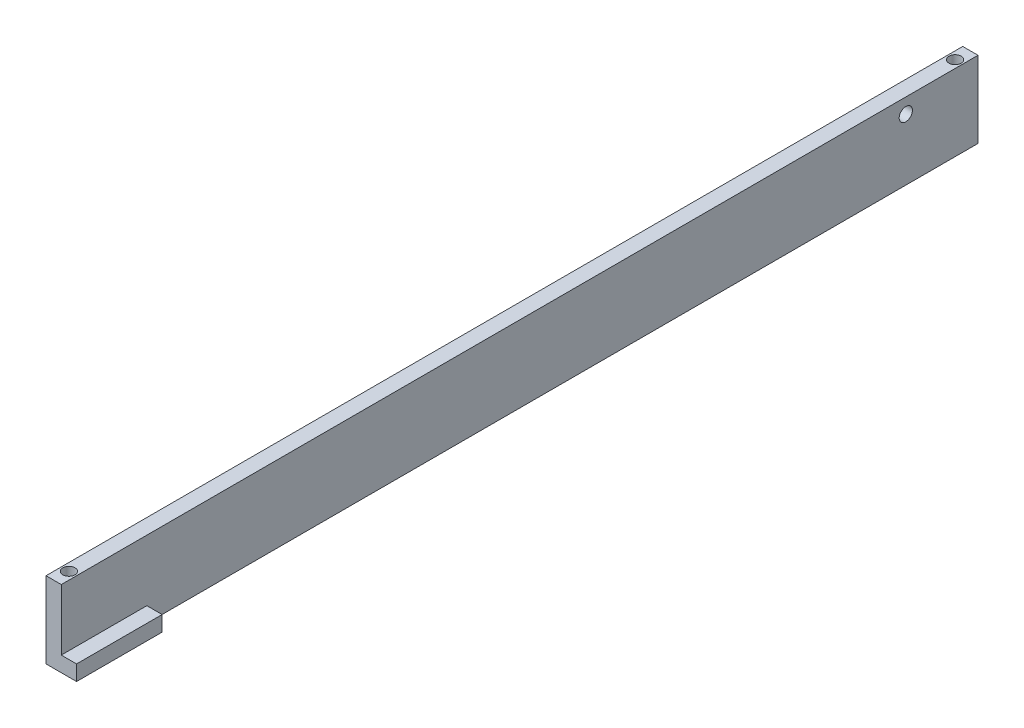
ISO-10303-21;
HEADER;
FILE_DESCRIPTION(('STEP AP214'),'2;1');
FILE_NAME('part.step','',(''),(''),'','','');
FILE_SCHEMA(('AUTOMOTIVE_DESIGN { 1 0 10303 214 1 1 1 1 }'));
ENDSEC;
DATA;
#1=APPLICATION_CONTEXT('core data for automotive mechanical design processes');
#2=APPLICATION_PROTOCOL_DEFINITION('international standard','automotive_design',2000,#1);
#3=PRODUCT_CONTEXT('',#1,'mechanical');
#4=PRODUCT('Part','Part','',(#3));
#5=PRODUCT_RELATED_PRODUCT_CATEGORY('part','',(#4));
#6=PRODUCT_DEFINITION_FORMATION('','',#4);
#7=PRODUCT_DEFINITION_CONTEXT('part definition',#1,'design');
#8=PRODUCT_DEFINITION('design','',#6,#7);
#9=PRODUCT_DEFINITION_SHAPE('','',#8);
#10=(LENGTH_UNIT() NAMED_UNIT(*) SI_UNIT(.MILLI.,.METRE.));
#11=(NAMED_UNIT(*) PLANE_ANGLE_UNIT() SI_UNIT($,.RADIAN.));
#12=(NAMED_UNIT(*) SI_UNIT($,.STERADIAN.) SOLID_ANGLE_UNIT());
#13=UNCERTAINTY_MEASURE_WITH_UNIT(LENGTH_MEASURE(1.E-05),#10,'distance_accuracy_value','');
#14=(GEOMETRIC_REPRESENTATION_CONTEXT(3) GLOBAL_UNCERTAINTY_ASSIGNED_CONTEXT((#13)) GLOBAL_UNIT_ASSIGNED_CONTEXT((#10,
#11,#12)) REPRESENTATION_CONTEXT('',''));
#15=CARTESIAN_POINT('',(0.,0.,0.));
#16=DIRECTION('',(0.,0.,1.));
#17=DIRECTION('',(1.,0.,0.));
#18=AXIS2_PLACEMENT_3D('',#15,#16,#17);
#19=CARTESIAN_POINT('',(0.,6.35,-381.));
#20=DIRECTION('',(1.,0.,0.));
#21=DIRECTION('',(0.,0.,-1.));
#22=AXIS2_PLACEMENT_3D('',#19,#20,#21);
#23=PLANE('',#22);
#24=DIRECTION('',(0.,-1.,0.));
#25=VECTOR('',#24,1.);
#26=CARTESIAN_POINT('',(0.,6.35,-35.56));
#27=LINE('',#26,#25);
#28=CARTESIAN_POINT('',(0.,6.35,-35.56));
#29=VERTEX_POINT('',#28);
#30=CARTESIAN_POINT('',(0.,0.,-35.56));
#31=VERTEX_POINT('',#30);
#32=EDGE_CURVE('E120',#29,#31,#27,.T.);
#33=ORIENTED_EDGE('',*,*,#32,.F.);
#34=DIRECTION('',(0.,0.,1.));
#35=VECTOR('',#34,1.);
#36=CARTESIAN_POINT('',(0.,6.35,-381.));
#37=LINE('',#36,#35);
#38=CARTESIAN_POINT('',(0.,6.35,0.));
#39=VERTEX_POINT('',#38);
#40=EDGE_CURVE('E40',#29,#39,#37,.T.);
#41=ORIENTED_EDGE('',*,*,#40,.T.);
#42=DIRECTION('',(0.,1.,0.));
#43=VECTOR('',#42,1.);
#44=CARTESIAN_POINT('',(0.,6.35,0.));
#45=LINE('',#44,#43);
#46=CARTESIAN_POINT('',(0.,0.,0.));
#47=VERTEX_POINT('',#46);
#48=EDGE_CURVE('E144',#47,#39,#45,.T.);
#49=ORIENTED_EDGE('',*,*,#48,.F.);
#50=DIRECTION('',(0.,0.,1.));
#51=VECTOR('',#50,1.);
#52=CARTESIAN_POINT('',(0.,0.,-381.));
#53=LINE('',#52,#51);
#54=EDGE_CURVE('E11',#31,#47,#53,.T.);
#55=ORIENTED_EDGE('',*,*,#54,.F.);
#56=EDGE_LOOP('',(#33,#41,#49,#55));
#57=FACE_BOUND('',#56,.T.);
#58=ADVANCED_FACE('F37',(#57),#23,.T.);
#59=CARTESIAN_POINT('',(0.,0.,-381.));
#60=DIRECTION('',(0.,-1.,0.));
#61=DIRECTION('',(1.,0.,0.));
#62=AXIS2_PLACEMENT_3D('',#59,#60,#61);
#63=PLANE('',#62);
#64=DIRECTION('',(0.,0.,-1.));
#65=VECTOR('',#64,1.);
#66=CARTESIAN_POINT('',(-6.35,0.,-35.56));
#67=LINE('',#66,#65);
#68=CARTESIAN_POINT('',(-6.35,0.,-35.56));
#69=VERTEX_POINT('',#68);
#70=CARTESIAN_POINT('',(-6.35,0.,-381.));
#71=VERTEX_POINT('',#70);
#72=EDGE_CURVE('E176',#69,#71,#67,.T.);
#73=ORIENTED_EDGE('',*,*,#72,.F.);
#74=DIRECTION('',(-1.,0.,0.));
#75=VECTOR('',#74,1.);
#76=CARTESIAN_POINT('',(-6.35,0.,-35.56));
#77=LINE('',#76,#75);
#78=EDGE_CURVE('E109',#31,#69,#77,.T.);
#79=ORIENTED_EDGE('',*,*,#78,.F.);
#80=ORIENTED_EDGE('',*,*,#54,.T.);
#81=DIRECTION('',(1.,0.,0.));
#82=VECTOR('',#81,1.);
#83=CARTESIAN_POINT('',(0.,0.,0.));
#84=LINE('',#83,#82);
#85=CARTESIAN_POINT('',(-12.7,0.,0.));
#86=VERTEX_POINT('',#85);
#87=EDGE_CURVE('E132',#86,#47,#84,.T.);
#88=ORIENTED_EDGE('',*,*,#87,.F.);
#89=DIRECTION('',(0.,0.,1.));
#90=VECTOR('',#89,1.);
#91=CARTESIAN_POINT('',(-12.7,0.,-381.));
#92=LINE('',#91,#90);
#93=CARTESIAN_POINT('',(-12.7,0.,-381.));
#94=VERTEX_POINT('',#93);
#95=EDGE_CURVE('E45',#94,#86,#92,.T.);
#96=ORIENTED_EDGE('',*,*,#95,.F.);
#97=DIRECTION('',(1.,0.,0.));
#98=VECTOR('',#97,1.);
#99=CARTESIAN_POINT('',(0.,0.,-381.));
#100=LINE('',#99,#98);
#101=EDGE_CURVE('E128',#94,#71,#100,.T.);
#102=ORIENTED_EDGE('',*,*,#101,.T.);
#103=EDGE_LOOP('',(#73,#79,#80,#88,#96,#102));
#104=FACE_BOUND('',#103,.T.);
#105=CARTESIAN_POINT('',(-9.52499999999996,0.,-374.65));
#106=DIRECTION('',(0.,-1.,0.));
#107=DIRECTION('',(1.,0.,0.));
#108=AXIS2_PLACEMENT_3D('',#105,#106,#107);
#109=CIRCLE('',#108,2.54000000000001);
#110=CARTESIAN_POINT('',(-6.98499999999995,0.,-374.65));
#111=VERTEX_POINT('',#110);
#112=EDGE_CURVE('E179',#111,#111,#109,.T.);
#113=ORIENTED_EDGE('',*,*,#112,.F.);
#114=EDGE_LOOP('',(#113));
#115=FACE_BOUND('',#114,.T.);
#116=CARTESIAN_POINT('',(-9.525,0.,-6.35));
#117=DIRECTION('',(0.,-1.,0.));
#118=DIRECTION('',(1.,0.,0.));
#119=AXIS2_PLACEMENT_3D('',#116,#117,#118);
#120=CIRCLE('',#119,2.54);
#121=CARTESIAN_POINT('',(-6.985,0.,-6.35));
#122=VERTEX_POINT('',#121);
#123=EDGE_CURVE('E175',#122,#122,#120,.T.);
#124=ORIENTED_EDGE('',*,*,#123,.F.);
#125=EDGE_LOOP('',(#124));
#126=FACE_BOUND('',#125,.T.);
#127=ADVANCED_FACE('F187',(#104,#115,#126),#63,.T.);
#128=CARTESIAN_POINT('',(-12.7,0.,-381.));
#129=DIRECTION('',(-1.,0.,0.));
#130=DIRECTION('',(0.,-1.,0.));
#131=AXIS2_PLACEMENT_3D('',#128,#129,#130);
#132=PLANE('',#131);
#133=CARTESIAN_POINT('',(-12.7,25.562499999993,-351.000000000093));
#134=DIRECTION('',(-1.,0.,0.));
#135=DIRECTION('',(0.,-1.,0.));
#136=AXIS2_PLACEMENT_3D('',#133,#134,#135);
#137=CIRCLE('',#136,2.75000000003093);
#138=CARTESIAN_POINT('',(-12.7,22.8124999999621,-351.000000000093));
#139=VERTEX_POINT('',#138);
#140=EDGE_CURVE('E147',#139,#139,#137,.T.);
#141=ORIENTED_EDGE('',*,*,#140,.F.);
#142=EDGE_LOOP('',(#141));
#143=FACE_BOUND('',#142,.T.);
#144=DIRECTION('',(0.,-1.,0.));
#145=VECTOR('',#144,1.);
#146=CARTESIAN_POINT('',(-12.7,0.,0.));
#147=LINE('',#146,#145);
#148=CARTESIAN_POINT('',(-12.7,31.75,0.));
#149=VERTEX_POINT('',#148);
#150=EDGE_CURVE('E135',#149,#86,#147,.T.);
#151=ORIENTED_EDGE('',*,*,#150,.F.);
#152=DIRECTION('',(0.,0.,1.));
#153=VECTOR('',#152,1.);
#154=CARTESIAN_POINT('',(-12.7,31.75,-381.));
#155=LINE('',#154,#153);
#156=CARTESIAN_POINT('',(-12.7,31.75,-381.));
#157=VERTEX_POINT('',#156);
#158=EDGE_CURVE('E126',#157,#149,#155,.T.);
#159=ORIENTED_EDGE('',*,*,#158,.F.);
#160=DIRECTION('',(0.,-1.,0.));
#161=VECTOR('',#160,1.);
#162=CARTESIAN_POINT('',(-12.7,0.,-381.));
#163=LINE('',#162,#161);
#164=EDGE_CURVE('E149',#157,#94,#163,.T.);
#165=ORIENTED_EDGE('',*,*,#164,.T.);
#166=ORIENTED_EDGE('',*,*,#95,.T.);
#167=EDGE_LOOP('',(#151,#159,#165,#166));
#168=FACE_BOUND('',#167,.T.);
#169=ADVANCED_FACE('F193',(#143,#168),#132,.T.);
#170=CARTESIAN_POINT('',(-12.7,31.75,-381.));
#171=DIRECTION('',(0.,1.,0.));
#172=DIRECTION('',(0.,0.,1.));
#173=AXIS2_PLACEMENT_3D('',#170,#171,#172);
#174=PLANE('',#173);
#175=CARTESIAN_POINT('',(-9.525,31.75,-6.35));
#176=DIRECTION('',(0.,1.,0.));
#177=DIRECTION('',(0.,0.,1.));
#178=AXIS2_PLACEMENT_3D('',#175,#176,#177);
#179=CIRCLE('',#178,2.54);
#180=CARTESIAN_POINT('',(-9.525,31.75,-3.81));
#181=VERTEX_POINT('',#180);
#182=EDGE_CURVE('E167',#181,#181,#179,.T.);
#183=ORIENTED_EDGE('',*,*,#182,.F.);
#184=EDGE_LOOP('',(#183));
#185=FACE_BOUND('',#184,.T.);
#186=CARTESIAN_POINT('',(-9.525,31.75,-374.65));
#187=DIRECTION('',(0.,1.,0.));
#188=DIRECTION('',(0.,0.,1.));
#189=AXIS2_PLACEMENT_3D('',#186,#187,#188);
#190=CIRCLE('',#189,2.54);
#191=CARTESIAN_POINT('',(-9.525,31.75,-372.11));
#192=VERTEX_POINT('',#191);
#193=EDGE_CURVE('E163',#192,#192,#190,.T.);
#194=ORIENTED_EDGE('',*,*,#193,.F.);
#195=EDGE_LOOP('',(#194));
#196=FACE_BOUND('',#195,.T.);
#197=DIRECTION('',(-1.,0.,0.));
#198=VECTOR('',#197,1.);
#199=CARTESIAN_POINT('',(-12.7,31.75,0.));
#200=LINE('',#199,#198);
#201=CARTESIAN_POINT('',(-6.35,31.75,0.));
#202=VERTEX_POINT('',#201);
#203=EDGE_CURVE('E138',#202,#149,#200,.T.);
#204=ORIENTED_EDGE('',*,*,#203,.F.);
#205=DIRECTION('',(0.,0.,1.));
#206=VECTOR('',#205,1.);
#207=CARTESIAN_POINT('',(-6.35,31.75,-381.));
#208=LINE('',#207,#206);
#209=CARTESIAN_POINT('',(-6.35,31.75,-381.));
#210=VERTEX_POINT('',#209);
#211=EDGE_CURVE('E90',#210,#202,#208,.T.);
#212=ORIENTED_EDGE('',*,*,#211,.F.);
#213=DIRECTION('',(-1.,0.,0.));
#214=VECTOR('',#213,1.);
#215=CARTESIAN_POINT('',(-12.7,31.75,-381.));
#216=LINE('',#215,#214);
#217=EDGE_CURVE('E151',#210,#157,#216,.T.);
#218=ORIENTED_EDGE('',*,*,#217,.T.);
#219=ORIENTED_EDGE('',*,*,#158,.T.);
#220=EDGE_LOOP('',(#204,#212,#218,#219));
#221=FACE_BOUND('',#220,.T.);
#222=ADVANCED_FACE('F213',(#185,#196,#221),#174,.T.);
#223=CARTESIAN_POINT('',(-6.35,31.75,-381.));
#224=DIRECTION('',(1.,0.,0.));
#225=DIRECTION('',(0.,1.,0.));
#226=AXIS2_PLACEMENT_3D('',#223,#224,#225);
#227=PLANE('',#226);
#228=CARTESIAN_POINT('',(-6.35,25.562499999993,-351.000000000093));
#229=DIRECTION('',(1.,0.,0.));
#230=DIRECTION('',(0.,1.,0.));
#231=AXIS2_PLACEMENT_3D('',#228,#229,#230);
#232=CIRCLE('',#231,2.75000000003093);
#233=CARTESIAN_POINT('',(-6.35,28.312500000024,-351.000000000093));
#234=VERTEX_POINT('',#233);
#235=EDGE_CURVE('E154',#234,#234,#232,.F.);
#236=ORIENTED_EDGE('',*,*,#235,.T.);
#237=EDGE_LOOP('',(#236));
#238=FACE_BOUND('',#237,.T.);
#239=DIRECTION('',(0.,1.,0.));
#240=VECTOR('',#239,1.);
#241=CARTESIAN_POINT('',(-6.35,31.75,0.));
#242=LINE('',#241,#240);
#243=CARTESIAN_POINT('',(-6.35,6.35,0.));
#244=VERTEX_POINT('',#243);
#245=EDGE_CURVE('E124',#244,#202,#242,.T.);
#246=ORIENTED_EDGE('',*,*,#245,.F.);
#247=DIRECTION('',(0.,0.,1.));
#248=VECTOR('',#247,1.);
#249=CARTESIAN_POINT('',(-6.35,6.35,-381.));
#250=LINE('',#249,#248);
#251=CARTESIAN_POINT('',(-6.35,6.35,-35.56));
#252=VERTEX_POINT('',#251);
#253=EDGE_CURVE('E118',#252,#244,#250,.T.);
#254=ORIENTED_EDGE('',*,*,#253,.F.);
#255=DIRECTION('',(0.,1.,0.));
#256=VECTOR('',#255,1.);
#257=CARTESIAN_POINT('',(-6.35,6.35,-35.56));
#258=LINE('',#257,#256);
#259=EDGE_CURVE('E104',#69,#252,#258,.T.);
#260=ORIENTED_EDGE('',*,*,#259,.F.);
#261=ORIENTED_EDGE('',*,*,#72,.T.);
#262=DIRECTION('',(0.,1.,0.));
#263=VECTOR('',#262,1.);
#264=CARTESIAN_POINT('',(-6.35,31.75,-381.));
#265=LINE('',#264,#263);
#266=EDGE_CURVE('E53',#71,#210,#265,.T.);
#267=ORIENTED_EDGE('',*,*,#266,.T.);
#268=ORIENTED_EDGE('',*,*,#211,.T.);
#269=EDGE_LOOP('',(#246,#254,#260,#261,#267,#268));
#270=FACE_BOUND('',#269,.T.);
#271=ADVANCED_FACE('F122',(#238,#270),#227,.T.);
#272=CARTESIAN_POINT('',(-6.35,6.35,-381.));
#273=DIRECTION('',(0.,1.,0.));
#274=DIRECTION('',(0.,0.,1.));
#275=AXIS2_PLACEMENT_3D('',#272,#273,#274);
#276=PLANE('',#275);
#277=DIRECTION('',(1.,0.,0.));
#278=VECTOR('',#277,1.);
#279=CARTESIAN_POINT('',(-6.35,6.35,-35.56));
#280=LINE('',#279,#278);
#281=EDGE_CURVE('E107',#252,#29,#280,.T.);
#282=ORIENTED_EDGE('',*,*,#281,.F.);
#283=ORIENTED_EDGE('',*,*,#253,.T.);
#284=DIRECTION('',(-1.,0.,0.));
#285=VECTOR('',#284,1.);
#286=CARTESIAN_POINT('',(-6.35,6.35,0.));
#287=LINE('',#286,#285);
#288=EDGE_CURVE('E142',#39,#244,#287,.T.);
#289=ORIENTED_EDGE('',*,*,#288,.F.);
#290=ORIENTED_EDGE('',*,*,#40,.F.);
#291=EDGE_LOOP('',(#282,#283,#289,#290));
#292=FACE_BOUND('',#291,.T.);
#293=ADVANCED_FACE('F116',(#292),#276,.T.);
#294=CARTESIAN_POINT('',(0.,0.,-381.));
#295=DIRECTION('',(0.,0.,-1.));
#296=DIRECTION('',(-1.,0.,0.));
#297=AXIS2_PLACEMENT_3D('',#294,#295,#296);
#298=PLANE('',#297);
#299=ORIENTED_EDGE('',*,*,#266,.F.);
#300=ORIENTED_EDGE('',*,*,#101,.F.);
#301=ORIENTED_EDGE('',*,*,#164,.F.);
#302=ORIENTED_EDGE('',*,*,#217,.F.);
#303=EDGE_LOOP('',(#299,#300,#301,#302));
#304=FACE_BOUND('',#303,.T.);
#305=ADVANCED_FACE('F195',(#304),#298,.T.);
#306=CARTESIAN_POINT('',(0.,0.,0.));
#307=DIRECTION('',(0.,0.,-1.));
#308=DIRECTION('',(-1.,0.,0.));
#309=AXIS2_PLACEMENT_3D('',#306,#307,#308);
#310=PLANE('',#309);
#311=ORIENTED_EDGE('',*,*,#48,.T.);
#312=ORIENTED_EDGE('',*,*,#288,.T.);
#313=ORIENTED_EDGE('',*,*,#245,.T.);
#314=ORIENTED_EDGE('',*,*,#203,.T.);
#315=ORIENTED_EDGE('',*,*,#150,.T.);
#316=ORIENTED_EDGE('',*,*,#87,.T.);
#317=EDGE_LOOP('',(#311,#312,#313,#314,#315,#316));
#318=FACE_BOUND('',#317,.T.);
#319=ADVANCED_FACE('F190',(#318),#310,.F.);
#320=CARTESIAN_POINT('',(0.000999999999999265,25.562499999993,-351.000000000093));
#321=DIRECTION('',(-1.,0.,0.));
#322=DIRECTION('',(0.,-1.,0.));
#323=AXIS2_PLACEMENT_3D('',#320,#321,#322);
#324=CYLINDRICAL_SURFACE('',#323,2.75000000003093);
#325=ORIENTED_EDGE('',*,*,#235,.F.);
#326=EDGE_LOOP('',(#325));
#327=FACE_BOUND('',#326,.T.);
#328=ORIENTED_EDGE('',*,*,#140,.T.);
#329=EDGE_LOOP('',(#328));
#330=FACE_BOUND('',#329,.T.);
#331=ADVANCED_FACE('F202',(#327,#330),#324,.F.);
#332=CARTESIAN_POINT('',(-9.525,24.13,-374.65));
#333=DIRECTION('',(0.,1.,0.));
#334=DIRECTION('',(0.,0.,1.));
#335=AXIS2_PLACEMENT_3D('',#332,#333,#334);
#336=CYLINDRICAL_SURFACE('',#335,2.54);
#337=CARTESIAN_POINT('',(-9.525,24.13,-374.65));
#338=DIRECTION('',(0.,1.,0.));
#339=DIRECTION('',(0.,0.,1.));
#340=AXIS2_PLACEMENT_3D('',#337,#338,#339);
#341=CIRCLE('',#340,2.54);
#342=CARTESIAN_POINT('',(-9.525,24.13,-372.11));
#343=VERTEX_POINT('',#342);
#344=EDGE_CURVE('E160',#343,#343,#341,.T.);
#345=CARTESIAN_POINT('',(-9.525,24.13,-372.11));
#346=CARTESIAN_POINT('',(-9.525,24.209375,-372.11));
#347=CARTESIAN_POINT('',(-9.525,24.28875,-372.11));
#348=CARTESIAN_POINT('',(-9.525,24.4475,-372.11));
#349=CARTESIAN_POINT('',(-9.525,24.526875,-372.11));
#350=CARTESIAN_POINT('',(-9.525,24.685625,-372.11));
#351=CARTESIAN_POINT('',(-9.525,24.765,-372.11));
#352=CARTESIAN_POINT('',(-9.525,24.92375,-372.11));
#353=CARTESIAN_POINT('',(-9.525,25.003125,-372.11));
#354=CARTESIAN_POINT('',(-9.525,25.161875,-372.11));
#355=CARTESIAN_POINT('',(-9.525,25.24125,-372.11));
#356=CARTESIAN_POINT('',(-9.525,25.4,-372.11));
#357=CARTESIAN_POINT('',(-9.525,25.479375,-372.11));
#358=CARTESIAN_POINT('',(-9.525,25.638125,-372.11));
#359=CARTESIAN_POINT('',(-9.525,25.7175,-372.11));
#360=CARTESIAN_POINT('',(-9.525,25.87625,-372.11));
#361=CARTESIAN_POINT('',(-9.525,25.955625,-372.11));
#362=CARTESIAN_POINT('',(-9.525,26.114375,-372.11));
#363=CARTESIAN_POINT('',(-9.525,26.19375,-372.11));
#364=CARTESIAN_POINT('',(-9.525,26.3525,-372.11));
#365=CARTESIAN_POINT('',(-9.525,26.431875,-372.11));
#366=CARTESIAN_POINT('',(-9.525,26.590625,-372.11));
#367=CARTESIAN_POINT('',(-9.525,26.67,-372.11));
#368=CARTESIAN_POINT('',(-9.525,26.82875,-372.11));
#369=CARTESIAN_POINT('',(-9.525,26.908125,-372.11));
#370=CARTESIAN_POINT('',(-9.525,27.066875,-372.11));
#371=CARTESIAN_POINT('',(-9.525,27.14625,-372.11));
#372=CARTESIAN_POINT('',(-9.525,27.305,-372.11));
#373=CARTESIAN_POINT('',(-9.525,27.384375,-372.11));
#374=CARTESIAN_POINT('',(-9.525,27.543125,-372.11));
#375=CARTESIAN_POINT('',(-9.525,27.6225,-372.11));
#376=CARTESIAN_POINT('',(-9.525,27.78125,-372.11));
#377=CARTESIAN_POINT('',(-9.525,27.860625,-372.11));
#378=CARTESIAN_POINT('',(-9.525,28.019375,-372.11));
#379=CARTESIAN_POINT('',(-9.525,28.09875,-372.11));
#380=CARTESIAN_POINT('',(-9.525,28.2575,-372.11));
#381=CARTESIAN_POINT('',(-9.525,28.336875,-372.11));
#382=CARTESIAN_POINT('',(-9.525,28.495625,-372.11));
#383=CARTESIAN_POINT('',(-9.525,28.575,-372.11));
#384=CARTESIAN_POINT('',(-9.525,28.73375,-372.11));
#385=CARTESIAN_POINT('',(-9.525,28.813125,-372.11));
#386=CARTESIAN_POINT('',(-9.525,28.971875,-372.11));
#387=CARTESIAN_POINT('',(-9.525,29.05125,-372.11));
#388=CARTESIAN_POINT('',(-9.525,29.21,-372.11));
#389=CARTESIAN_POINT('',(-9.525,29.289375,-372.11));
#390=CARTESIAN_POINT('',(-9.525,29.448125,-372.11));
#391=CARTESIAN_POINT('',(-9.525,29.5275,-372.11));
#392=CARTESIAN_POINT('',(-9.525,29.68625,-372.11));
#393=CARTESIAN_POINT('',(-9.525,29.765625,-372.11));
#394=CARTESIAN_POINT('',(-9.525,29.924375,-372.11));
#395=CARTESIAN_POINT('',(-9.525,30.00375,-372.11));
#396=CARTESIAN_POINT('',(-9.525,30.1625,-372.11));
#397=CARTESIAN_POINT('',(-9.525,30.241875,-372.11));
#398=CARTESIAN_POINT('',(-9.525,30.400625,-372.11));
#399=CARTESIAN_POINT('',(-9.525,30.48,-372.11));
#400=CARTESIAN_POINT('',(-9.525,30.63875,-372.11));
#401=CARTESIAN_POINT('',(-9.525,30.718125,-372.11));
#402=CARTESIAN_POINT('',(-9.525,30.876875,-372.11));
#403=CARTESIAN_POINT('',(-9.525,30.95625,-372.11));
#404=CARTESIAN_POINT('',(-9.525,31.115,-372.11));
#405=CARTESIAN_POINT('',(-9.525,31.194375,-372.11));
#406=CARTESIAN_POINT('',(-9.525,31.353125,-372.11));
#407=CARTESIAN_POINT('',(-9.525,31.4325,-372.11));
#408=CARTESIAN_POINT('',(-9.525,31.59125,-372.11));
#409=CARTESIAN_POINT('',(-9.525,31.670625,-372.11));
#410=CARTESIAN_POINT('',(-9.525,31.75,-372.11));
#411=B_SPLINE_CURVE_WITH_KNOTS('',3,(#345,#346,#347,#348,#349,#350,#351,#352,#353,#354,#355,
#356,#357,#358,#359,#360,#361,#362,#363,#364,#365,#366,#367,#368,#369,#370,#371,#372,#373,#374,
#375,#376,#377,#378,#379,#380,#381,#382,#383,#384,#385,#386,#387,#388,#389,#390,#391,#392,#393,
#394,#395,#396,#397,#398,#399,#400,#401,#402,#403,#404,#405,#406,#407,#408,#409,#410),
.UNSPECIFIED.,.F.,.F.,(4,2,2,2,2,2,2,2,2,2,2,2,2,2,2,2,2,2,2,2,2,2,2,2,2,2,2,2,2,2,2,2,4),(0.,
0.238124999999999,0.476249999999998,0.714374999999996,0.952499999999998,1.190625,1.42875,
1.666875,1.905,2.143125,2.38125,2.619375,2.8575,3.095625,3.33375,3.571875,3.81,4.048125,
4.28624999999999,4.52437499999999,4.7625,5.00062499999999,5.23875,5.476875,5.71499999999999,
5.95312499999999,6.19125,6.42937499999999,6.6675,6.905625,7.14374999999999,7.38187499999999,
7.61999999999999),.UNSPECIFIED.);
#412=EDGE_CURVE('BSEAM228',#343,#192,#411,.T.);
#413=ORIENTED_EDGE('',*,*,#344,.F.);
#414=ORIENTED_EDGE('',*,*,#193,.T.);
#415=ORIENTED_EDGE('',*,*,#412,.T.);
#416=ORIENTED_EDGE('',*,*,#412,.F.);
#417=EDGE_LOOP('',(#413,#415,#414,#416));
#418=FACE_BOUND('',#417,.T.);
#419=ADVANCED_FACE('F228',(#418),#336,.F.);
#420=CARTESIAN_POINT('',(-9.525,24.13,-374.65));
#421=DIRECTION('',(0.,1.,0.));
#422=DIRECTION('',(0.,0.,1.));
#423=AXIS2_PLACEMENT_3D('',#420,#421,#422);
#424=PLANE('',#423);
#425=ORIENTED_EDGE('',*,*,#344,.T.);
#426=EDGE_LOOP('',(#425));
#427=FACE_BOUND('',#426,.T.);
#428=ADVANCED_FACE('F233',(#427),#424,.T.);
#429=CARTESIAN_POINT('',(-9.525,24.13,-6.35));
#430=DIRECTION('',(0.,1.,0.));
#431=DIRECTION('',(0.,0.,1.));
#432=AXIS2_PLACEMENT_3D('',#429,#430,#431);
#433=CYLINDRICAL_SURFACE('',#432,2.54);
#434=CARTESIAN_POINT('',(-9.525,24.13,-6.35));
#435=DIRECTION('',(0.,1.,0.));
#436=DIRECTION('',(0.,0.,1.));
#437=AXIS2_PLACEMENT_3D('',#434,#435,#436);
#438=CIRCLE('',#437,2.54);
#439=CARTESIAN_POINT('',(-9.525,24.13,-3.81));
#440=VERTEX_POINT('',#439);
#441=EDGE_CURVE('E157',#440,#440,#438,.T.);
#442=CARTESIAN_POINT('',(-9.525,24.13,-3.81));
#443=CARTESIAN_POINT('',(-9.525,24.209375,-3.81));
#444=CARTESIAN_POINT('',(-9.525,24.28875,-3.81));
#445=CARTESIAN_POINT('',(-9.525,24.4475,-3.81));
#446=CARTESIAN_POINT('',(-9.525,24.526875,-3.81));
#447=CARTESIAN_POINT('',(-9.525,24.685625,-3.81));
#448=CARTESIAN_POINT('',(-9.525,24.765,-3.81));
#449=CARTESIAN_POINT('',(-9.525,24.92375,-3.81));
#450=CARTESIAN_POINT('',(-9.525,25.003125,-3.81));
#451=CARTESIAN_POINT('',(-9.525,25.161875,-3.81));
#452=CARTESIAN_POINT('',(-9.525,25.24125,-3.81));
#453=CARTESIAN_POINT('',(-9.525,25.4,-3.81));
#454=CARTESIAN_POINT('',(-9.525,25.479375,-3.81));
#455=CARTESIAN_POINT('',(-9.525,25.638125,-3.81));
#456=CARTESIAN_POINT('',(-9.525,25.7175,-3.81));
#457=CARTESIAN_POINT('',(-9.525,25.87625,-3.81));
#458=CARTESIAN_POINT('',(-9.525,25.955625,-3.81));
#459=CARTESIAN_POINT('',(-9.525,26.114375,-3.81));
#460=CARTESIAN_POINT('',(-9.525,26.19375,-3.81));
#461=CARTESIAN_POINT('',(-9.525,26.3525,-3.81));
#462=CARTESIAN_POINT('',(-9.525,26.431875,-3.81));
#463=CARTESIAN_POINT('',(-9.525,26.590625,-3.81));
#464=CARTESIAN_POINT('',(-9.525,26.67,-3.81));
#465=CARTESIAN_POINT('',(-9.525,26.82875,-3.81));
#466=CARTESIAN_POINT('',(-9.525,26.908125,-3.81));
#467=CARTESIAN_POINT('',(-9.525,27.066875,-3.81));
#468=CARTESIAN_POINT('',(-9.525,27.14625,-3.81));
#469=CARTESIAN_POINT('',(-9.525,27.305,-3.81));
#470=CARTESIAN_POINT('',(-9.525,27.384375,-3.81));
#471=CARTESIAN_POINT('',(-9.525,27.543125,-3.81));
#472=CARTESIAN_POINT('',(-9.525,27.6225,-3.81));
#473=CARTESIAN_POINT('',(-9.525,27.78125,-3.81));
#474=CARTESIAN_POINT('',(-9.525,27.860625,-3.81));
#475=CARTESIAN_POINT('',(-9.525,28.019375,-3.81));
#476=CARTESIAN_POINT('',(-9.525,28.09875,-3.81));
#477=CARTESIAN_POINT('',(-9.525,28.2575,-3.81));
#478=CARTESIAN_POINT('',(-9.525,28.336875,-3.81));
#479=CARTESIAN_POINT('',(-9.525,28.495625,-3.81));
#480=CARTESIAN_POINT('',(-9.525,28.575,-3.81));
#481=CARTESIAN_POINT('',(-9.525,28.73375,-3.81));
#482=CARTESIAN_POINT('',(-9.525,28.813125,-3.81));
#483=CARTESIAN_POINT('',(-9.525,28.971875,-3.81));
#484=CARTESIAN_POINT('',(-9.525,29.05125,-3.81));
#485=CARTESIAN_POINT('',(-9.525,29.21,-3.81));
#486=CARTESIAN_POINT('',(-9.525,29.289375,-3.81));
#487=CARTESIAN_POINT('',(-9.525,29.448125,-3.81));
#488=CARTESIAN_POINT('',(-9.525,29.5275,-3.81));
#489=CARTESIAN_POINT('',(-9.525,29.68625,-3.81));
#490=CARTESIAN_POINT('',(-9.525,29.765625,-3.81));
#491=CARTESIAN_POINT('',(-9.525,29.924375,-3.81));
#492=CARTESIAN_POINT('',(-9.525,30.00375,-3.81));
#493=CARTESIAN_POINT('',(-9.525,30.1625,-3.81));
#494=CARTESIAN_POINT('',(-9.525,30.241875,-3.81));
#495=CARTESIAN_POINT('',(-9.525,30.400625,-3.81));
#496=CARTESIAN_POINT('',(-9.525,30.48,-3.81));
#497=CARTESIAN_POINT('',(-9.525,30.63875,-3.81));
#498=CARTESIAN_POINT('',(-9.525,30.718125,-3.81));
#499=CARTESIAN_POINT('',(-9.525,30.876875,-3.81));
#500=CARTESIAN_POINT('',(-9.525,30.95625,-3.81));
#501=CARTESIAN_POINT('',(-9.525,31.115,-3.81));
#502=CARTESIAN_POINT('',(-9.525,31.194375,-3.81));
#503=CARTESIAN_POINT('',(-9.525,31.353125,-3.81));
#504=CARTESIAN_POINT('',(-9.525,31.4325,-3.81));
#505=CARTESIAN_POINT('',(-9.525,31.59125,-3.81));
#506=CARTESIAN_POINT('',(-9.525,31.670625,-3.81));
#507=CARTESIAN_POINT('',(-9.525,31.75,-3.81));
#508=B_SPLINE_CURVE_WITH_KNOTS('',3,(#442,#443,#444,#445,#446,#447,#448,#449,#450,#451,#452,
#453,#454,#455,#456,#457,#458,#459,#460,#461,#462,#463,#464,#465,#466,#467,#468,#469,#470,#471,
#472,#473,#474,#475,#476,#477,#478,#479,#480,#481,#482,#483,#484,#485,#486,#487,#488,#489,#490,
#491,#492,#493,#494,#495,#496,#497,#498,#499,#500,#501,#502,#503,#504,#505,#506,#507),
.UNSPECIFIED.,.F.,.F.,(4,2,2,2,2,2,2,2,2,2,2,2,2,2,2,2,2,2,2,2,2,2,2,2,2,2,2,2,2,2,2,2,4),(0.,
0.238124999999999,0.476249999999998,0.714374999999996,0.952499999999998,1.190625,1.42875,
1.666875,1.905,2.143125,2.38125,2.619375,2.8575,3.095625,3.33375,3.571875,3.81,4.048125,
4.28624999999999,4.52437499999999,4.7625,5.00062499999999,5.23875,5.476875,5.71499999999999,
5.95312499999999,6.19125,6.42937499999999,6.6675,6.905625,7.14374999999999,7.38187499999999,
7.61999999999999),.UNSPECIFIED.);
#509=EDGE_CURVE('BSEAM238',#440,#181,#508,.T.);
#510=ORIENTED_EDGE('',*,*,#441,.F.);
#511=ORIENTED_EDGE('',*,*,#182,.T.);
#512=ORIENTED_EDGE('',*,*,#509,.T.);
#513=ORIENTED_EDGE('',*,*,#509,.F.);
#514=EDGE_LOOP('',(#510,#512,#511,#513));
#515=FACE_BOUND('',#514,.T.);
#516=ADVANCED_FACE('F238',(#515),#433,.F.);
#517=CARTESIAN_POINT('',(-9.525,24.13,-6.35));
#518=DIRECTION('',(0.,1.,0.));
#519=DIRECTION('',(0.,0.,1.));
#520=AXIS2_PLACEMENT_3D('',#517,#518,#519);
#521=PLANE('',#520);
#522=ORIENTED_EDGE('',*,*,#441,.T.);
#523=EDGE_LOOP('',(#522));
#524=FACE_BOUND('',#523,.T.);
#525=ADVANCED_FACE('F243',(#524),#521,.T.);
#526=CARTESIAN_POINT('',(-9.525,7.62,-6.35));
#527=DIRECTION('',(0.,-1.,0.));
#528=DIRECTION('',(1.,0.,0.));
#529=AXIS2_PLACEMENT_3D('',#526,#527,#528);
#530=CYLINDRICAL_SURFACE('',#529,2.54);
#531=CARTESIAN_POINT('',(-9.525,7.62,-6.35));
#532=DIRECTION('',(0.,-1.,0.));
#533=DIRECTION('',(1.,0.,0.));
#534=AXIS2_PLACEMENT_3D('',#531,#532,#533);
#535=CIRCLE('',#534,2.54);
#536=CARTESIAN_POINT('',(-6.985,7.62,-6.35));
#537=VERTEX_POINT('',#536);
#538=EDGE_CURVE('E172',#537,#537,#535,.T.);
#539=CARTESIAN_POINT('',(-6.985,7.62,-6.35));
#540=CARTESIAN_POINT('',(-6.985,7.540625,-6.35));
#541=CARTESIAN_POINT('',(-6.985,7.46125,-6.35));
#542=CARTESIAN_POINT('',(-6.985,7.3025,-6.35));
#543=CARTESIAN_POINT('',(-6.985,7.223125,-6.35));
#544=CARTESIAN_POINT('',(-6.985,7.064375,-6.35));
#545=CARTESIAN_POINT('',(-6.985,6.985,-6.35));
#546=CARTESIAN_POINT('',(-6.985,6.82625,-6.35));
#547=CARTESIAN_POINT('',(-6.985,6.746875,-6.35));
#548=CARTESIAN_POINT('',(-6.985,6.588125,-6.35));
#549=CARTESIAN_POINT('',(-6.985,6.50875,-6.35));
#550=CARTESIAN_POINT('',(-6.985,6.35,-6.35));
#551=CARTESIAN_POINT('',(-6.985,6.270625,-6.35));
#552=CARTESIAN_POINT('',(-6.985,6.111875,-6.35));
#553=CARTESIAN_POINT('',(-6.985,6.0325,-6.35));
#554=CARTESIAN_POINT('',(-6.985,5.87375,-6.35));
#555=CARTESIAN_POINT('',(-6.985,5.794375,-6.35));
#556=CARTESIAN_POINT('',(-6.985,5.635625,-6.35));
#557=CARTESIAN_POINT('',(-6.985,5.55625,-6.35));
#558=CARTESIAN_POINT('',(-6.985,5.3975,-6.35));
#559=CARTESIAN_POINT('',(-6.985,5.318125,-6.35));
#560=CARTESIAN_POINT('',(-6.985,5.159375,-6.35));
#561=CARTESIAN_POINT('',(-6.985,5.08,-6.35));
#562=CARTESIAN_POINT('',(-6.985,4.92125,-6.35));
#563=CARTESIAN_POINT('',(-6.985,4.841875,-6.35));
#564=CARTESIAN_POINT('',(-6.985,4.683125,-6.35));
#565=CARTESIAN_POINT('',(-6.985,4.60375,-6.35));
#566=CARTESIAN_POINT('',(-6.985,4.445,-6.35));
#567=CARTESIAN_POINT('',(-6.985,4.365625,-6.35));
#568=CARTESIAN_POINT('',(-6.985,4.206875,-6.35));
#569=CARTESIAN_POINT('',(-6.985,4.1275,-6.35));
#570=CARTESIAN_POINT('',(-6.985,3.96875,-6.35));
#571=CARTESIAN_POINT('',(-6.985,3.889375,-6.35));
#572=CARTESIAN_POINT('',(-6.985,3.730625,-6.35));
#573=CARTESIAN_POINT('',(-6.985,3.65125,-6.35));
#574=CARTESIAN_POINT('',(-6.985,3.4925,-6.35));
#575=CARTESIAN_POINT('',(-6.985,3.413125,-6.35));
#576=CARTESIAN_POINT('',(-6.985,3.254375,-6.35));
#577=CARTESIAN_POINT('',(-6.985,3.175,-6.35));
#578=CARTESIAN_POINT('',(-6.985,3.01625,-6.35));
#579=CARTESIAN_POINT('',(-6.985,2.936875,-6.35));
#580=CARTESIAN_POINT('',(-6.985,2.778125,-6.35));
#581=CARTESIAN_POINT('',(-6.985,2.69875,-6.35));
#582=CARTESIAN_POINT('',(-6.985,2.54,-6.35));
#583=CARTESIAN_POINT('',(-6.985,2.460625,-6.35));
#584=CARTESIAN_POINT('',(-6.985,2.301875,-6.35));
#585=CARTESIAN_POINT('',(-6.985,2.2225,-6.35));
#586=CARTESIAN_POINT('',(-6.985,2.06375,-6.35));
#587=CARTESIAN_POINT('',(-6.985,1.984375,-6.35));
#588=CARTESIAN_POINT('',(-6.985,1.825625,-6.35));
#589=CARTESIAN_POINT('',(-6.985,1.74625,-6.35));
#590=CARTESIAN_POINT('',(-6.985,1.5875,-6.35));
#591=CARTESIAN_POINT('',(-6.985,1.508125,-6.35));
#592=CARTESIAN_POINT('',(-6.985,1.349375,-6.35));
#593=CARTESIAN_POINT('',(-6.985,1.27,-6.35));
#594=CARTESIAN_POINT('',(-6.985,1.11125,-6.35));
#595=CARTESIAN_POINT('',(-6.985,1.031875,-6.35));
#596=CARTESIAN_POINT('',(-6.985,0.873125,-6.35));
#597=CARTESIAN_POINT('',(-6.985,0.79375,-6.35));
#598=CARTESIAN_POINT('',(-6.985,0.635,-6.35));
#599=CARTESIAN_POINT('',(-6.985,0.555625,-6.35));
#600=CARTESIAN_POINT('',(-6.985,0.396875,-6.35));
#601=CARTESIAN_POINT('',(-6.985,0.3175,-6.35));
#602=CARTESIAN_POINT('',(-6.985,0.15875,-6.35));
#603=CARTESIAN_POINT('',(-6.985,0.0793749999999999,-6.35));
#604=CARTESIAN_POINT('',(-6.985,0.,-6.35));
#605=B_SPLINE_CURVE_WITH_KNOTS('',3,(#539,#540,#541,#542,#543,#544,#545,#546,#547,#548,#549,
#550,#551,#552,#553,#554,#555,#556,#557,#558,#559,#560,#561,#562,#563,#564,#565,#566,#567,#568,
#569,#570,#571,#572,#573,#574,#575,#576,#577,#578,#579,#580,#581,#582,#583,#584,#585,#586,#587,
#588,#589,#590,#591,#592,#593,#594,#595,#596,#597,#598,#599,#600,#601,#602,#603,#604),
.UNSPECIFIED.,.F.,.F.,(4,2,2,2,2,2,2,2,2,2,2,2,2,2,2,2,2,2,2,2,2,2,2,2,2,2,2,2,2,2,2,2,4),(0.,
0.238125,0.47625,0.714375000000001,0.9525,1.190625,1.42875,1.666875,1.905,2.143125,2.38125,
2.619375,2.8575,3.095625,3.33375,3.571875,3.81,4.048125,4.28625,4.524375,4.7625,5.000625,
5.23875,5.476875,5.715,5.953125,6.19125,6.429375,6.6675,6.905625,7.14375,7.381875,7.62),.UNSPECIFIED.);
#606=EDGE_CURVE('BSEAM247',#537,#122,#605,.T.);
#607=ORIENTED_EDGE('',*,*,#538,.F.);
#608=ORIENTED_EDGE('',*,*,#123,.T.);
#609=ORIENTED_EDGE('',*,*,#606,.T.);
#610=ORIENTED_EDGE('',*,*,#606,.F.);
#611=EDGE_LOOP('',(#607,#609,#608,#610));
#612=FACE_BOUND('',#611,.T.);
#613=ADVANCED_FACE('F247',(#612),#530,.F.);
#614=CARTESIAN_POINT('',(-9.525,7.62,-6.35));
#615=DIRECTION('',(0.,-1.,0.));
#616=DIRECTION('',(1.,0.,0.));
#617=AXIS2_PLACEMENT_3D('',#614,#615,#616);
#618=PLANE('',#617);
#619=ORIENTED_EDGE('',*,*,#538,.T.);
#620=EDGE_LOOP('',(#619));
#621=FACE_BOUND('',#620,.T.);
#622=ADVANCED_FACE('F249',(#621),#618,.T.);
#623=CARTESIAN_POINT('',(-9.52499999999996,7.62,-374.65));
#624=DIRECTION('',(0.,-1.,0.));
#625=DIRECTION('',(1.,0.,0.));
#626=AXIS2_PLACEMENT_3D('',#623,#624,#625);
#627=CYLINDRICAL_SURFACE('',#626,2.54000000000001);
#628=CARTESIAN_POINT('',(-9.52499999999996,7.62,-374.65));
#629=DIRECTION('',(0.,-1.,0.));
#630=DIRECTION('',(1.,0.,0.));
#631=AXIS2_PLACEMENT_3D('',#628,#629,#630);
#632=CIRCLE('',#631,2.54000000000001);
#633=CARTESIAN_POINT('',(-6.98499999999995,7.62,-374.65));
#634=VERTEX_POINT('',#633);
#635=EDGE_CURVE('E164',#634,#634,#632,.T.);
#636=CARTESIAN_POINT('',(-6.98499999999995,7.62,-374.65));
#637=CARTESIAN_POINT('',(-6.98499999999995,7.540625,-374.65));
#638=CARTESIAN_POINT('',(-6.98499999999995,7.46125,-374.65));
#639=CARTESIAN_POINT('',(-6.98499999999995,7.3025,-374.65));
#640=CARTESIAN_POINT('',(-6.98499999999995,7.223125,-374.65));
#641=CARTESIAN_POINT('',(-6.98499999999995,7.064375,-374.65));
#642=CARTESIAN_POINT('',(-6.98499999999995,6.985,-374.65));
#643=CARTESIAN_POINT('',(-6.98499999999995,6.82625,-374.65));
#644=CARTESIAN_POINT('',(-6.98499999999995,6.746875,-374.65));
#645=CARTESIAN_POINT('',(-6.98499999999995,6.588125,-374.65));
#646=CARTESIAN_POINT('',(-6.98499999999995,6.50875,-374.65));
#647=CARTESIAN_POINT('',(-6.98499999999995,6.35,-374.65));
#648=CARTESIAN_POINT('',(-6.98499999999995,6.270625,-374.65));
#649=CARTESIAN_POINT('',(-6.98499999999995,6.111875,-374.65));
#650=CARTESIAN_POINT('',(-6.98499999999995,6.0325,-374.65));
#651=CARTESIAN_POINT('',(-6.98499999999995,5.87375,-374.65));
#652=CARTESIAN_POINT('',(-6.98499999999995,5.794375,-374.65));
#653=CARTESIAN_POINT('',(-6.98499999999995,5.635625,-374.65));
#654=CARTESIAN_POINT('',(-6.98499999999995,5.55625,-374.65));
#655=CARTESIAN_POINT('',(-6.98499999999995,5.3975,-374.65));
#656=CARTESIAN_POINT('',(-6.98499999999995,5.318125,-374.65));
#657=CARTESIAN_POINT('',(-6.98499999999995,5.159375,-374.65));
#658=CARTESIAN_POINT('',(-6.98499999999995,5.08,-374.65));
#659=CARTESIAN_POINT('',(-6.98499999999995,4.92125,-374.65));
#660=CARTESIAN_POINT('',(-6.98499999999995,4.841875,-374.65));
#661=CARTESIAN_POINT('',(-6.98499999999995,4.683125,-374.65));
#662=CARTESIAN_POINT('',(-6.98499999999995,4.60375,-374.65));
#663=CARTESIAN_POINT('',(-6.98499999999995,4.445,-374.65));
#664=CARTESIAN_POINT('',(-6.98499999999995,4.365625,-374.65));
#665=CARTESIAN_POINT('',(-6.98499999999995,4.206875,-374.65));
#666=CARTESIAN_POINT('',(-6.98499999999995,4.1275,-374.65));
#667=CARTESIAN_POINT('',(-6.98499999999995,3.96875,-374.65));
#668=CARTESIAN_POINT('',(-6.98499999999995,3.889375,-374.65));
#669=CARTESIAN_POINT('',(-6.98499999999995,3.730625,-374.65));
#670=CARTESIAN_POINT('',(-6.98499999999995,3.65125,-374.65));
#671=CARTESIAN_POINT('',(-6.98499999999995,3.4925,-374.65));
#672=CARTESIAN_POINT('',(-6.98499999999995,3.413125,-374.65));
#673=CARTESIAN_POINT('',(-6.98499999999995,3.254375,-374.65));
#674=CARTESIAN_POINT('',(-6.98499999999995,3.175,-374.65));
#675=CARTESIAN_POINT('',(-6.98499999999995,3.01625,-374.65));
#676=CARTESIAN_POINT('',(-6.98499999999995,2.936875,-374.65));
#677=CARTESIAN_POINT('',(-6.98499999999995,2.778125,-374.65));
#678=CARTESIAN_POINT('',(-6.98499999999995,2.69875,-374.65));
#679=CARTESIAN_POINT('',(-6.98499999999995,2.54,-374.65));
#680=CARTESIAN_POINT('',(-6.98499999999995,2.460625,-374.65));
#681=CARTESIAN_POINT('',(-6.98499999999995,2.301875,-374.65));
#682=CARTESIAN_POINT('',(-6.98499999999995,2.2225,-374.65));
#683=CARTESIAN_POINT('',(-6.98499999999995,2.06375,-374.65));
#684=CARTESIAN_POINT('',(-6.98499999999995,1.984375,-374.65));
#685=CARTESIAN_POINT('',(-6.98499999999995,1.825625,-374.65));
#686=CARTESIAN_POINT('',(-6.98499999999995,1.74625,-374.65));
#687=CARTESIAN_POINT('',(-6.98499999999995,1.5875,-374.65));
#688=CARTESIAN_POINT('',(-6.98499999999995,1.508125,-374.65));
#689=CARTESIAN_POINT('',(-6.98499999999995,1.349375,-374.65));
#690=CARTESIAN_POINT('',(-6.98499999999995,1.27,-374.65));
#691=CARTESIAN_POINT('',(-6.98499999999995,1.11125,-374.65));
#692=CARTESIAN_POINT('',(-6.98499999999995,1.031875,-374.65));
#693=CARTESIAN_POINT('',(-6.98499999999995,0.873125,-374.65));
#694=CARTESIAN_POINT('',(-6.98499999999995,0.79375,-374.65));
#695=CARTESIAN_POINT('',(-6.98499999999995,0.635,-374.65));
#696=CARTESIAN_POINT('',(-6.98499999999995,0.555625,-374.65));
#697=CARTESIAN_POINT('',(-6.98499999999995,0.396875,-374.65));
#698=CARTESIAN_POINT('',(-6.98499999999995,0.3175,-374.65));
#699=CARTESIAN_POINT('',(-6.98499999999995,0.15875,-374.65));
#700=CARTESIAN_POINT('',(-6.98499999999995,0.0793749999999999,-374.65));
#701=CARTESIAN_POINT('',(-6.98499999999995,0.,-374.65));
#702=B_SPLINE_CURVE_WITH_KNOTS('',3,(#636,#637,#638,#639,#640,#641,#642,#643,#644,#645,#646,
#647,#648,#649,#650,#651,#652,#653,#654,#655,#656,#657,#658,#659,#660,#661,#662,#663,#664,#665,
#666,#667,#668,#669,#670,#671,#672,#673,#674,#675,#676,#677,#678,#679,#680,#681,#682,#683,#684,
#685,#686,#687,#688,#689,#690,#691,#692,#693,#694,#695,#696,#697,#698,#699,#700,#701),
.UNSPECIFIED.,.F.,.F.,(4,2,2,2,2,2,2,2,2,2,2,2,2,2,2,2,2,2,2,2,2,2,2,2,2,2,2,2,2,2,2,2,4),(0.,
0.238125,0.47625,0.714375000000001,0.9525,1.190625,1.42875,1.666875,1.905,2.143125,2.38125,
2.619375,2.8575,3.095625,3.33375,3.571875,3.81,4.048125,4.28625,4.524375,4.7625,5.000625,
5.23875,5.476875,5.715,5.953125,6.19125,6.429375,6.6675,6.905625,7.14375,7.381875,7.62),.UNSPECIFIED.);
#703=EDGE_CURVE('BSEAM252',#634,#111,#702,.T.);
#704=ORIENTED_EDGE('',*,*,#635,.F.);
#705=ORIENTED_EDGE('',*,*,#112,.T.);
#706=ORIENTED_EDGE('',*,*,#703,.T.);
#707=ORIENTED_EDGE('',*,*,#703,.F.);
#708=EDGE_LOOP('',(#704,#706,#705,#707));
#709=FACE_BOUND('',#708,.T.);
#710=ADVANCED_FACE('F252',(#709),#627,.F.);
#711=CARTESIAN_POINT('',(-9.52499999999996,7.62,-374.65));
#712=DIRECTION('',(0.,-1.,0.));
#713=DIRECTION('',(1.,0.,0.));
#714=AXIS2_PLACEMENT_3D('',#711,#712,#713);
#715=PLANE('',#714);
#716=ORIENTED_EDGE('',*,*,#635,.T.);
#717=EDGE_LOOP('',(#716));
#718=FACE_BOUND('',#717,.T.);
#719=ADVANCED_FACE('F259',(#718),#715,.T.);
#720=CARTESIAN_POINT('',(0.,0.,-35.56));
#721=DIRECTION('',(0.,0.,1.));
#722=DIRECTION('',(1.,0.,0.));
#723=AXIS2_PLACEMENT_3D('',#720,#721,#722);
#724=PLANE('',#723);
#725=ORIENTED_EDGE('',*,*,#259,.T.);
#726=ORIENTED_EDGE('',*,*,#281,.T.);
#727=ORIENTED_EDGE('',*,*,#32,.T.);
#728=ORIENTED_EDGE('',*,*,#78,.T.);
#729=EDGE_LOOP('',(#725,#726,#727,#728));
#730=FACE_BOUND('',#729,.T.);
#731=ADVANCED_FACE('F106',(#730),#724,.F.);
#732=CLOSED_SHELL('',(#58,#127,#169,#222,#271,#293,#305,#319,#331,#419,#428,#516,#525,#613,#622,
#710,#719,#731));
#733=MANIFOLD_SOLID_BREP('B2',#732);
#734=ADVANCED_BREP_SHAPE_REPRESENTATION('',(#18,#733),#14);
#735=SHAPE_DEFINITION_REPRESENTATION(#9,#734);
ENDSEC;
END-ISO-10303-21;
